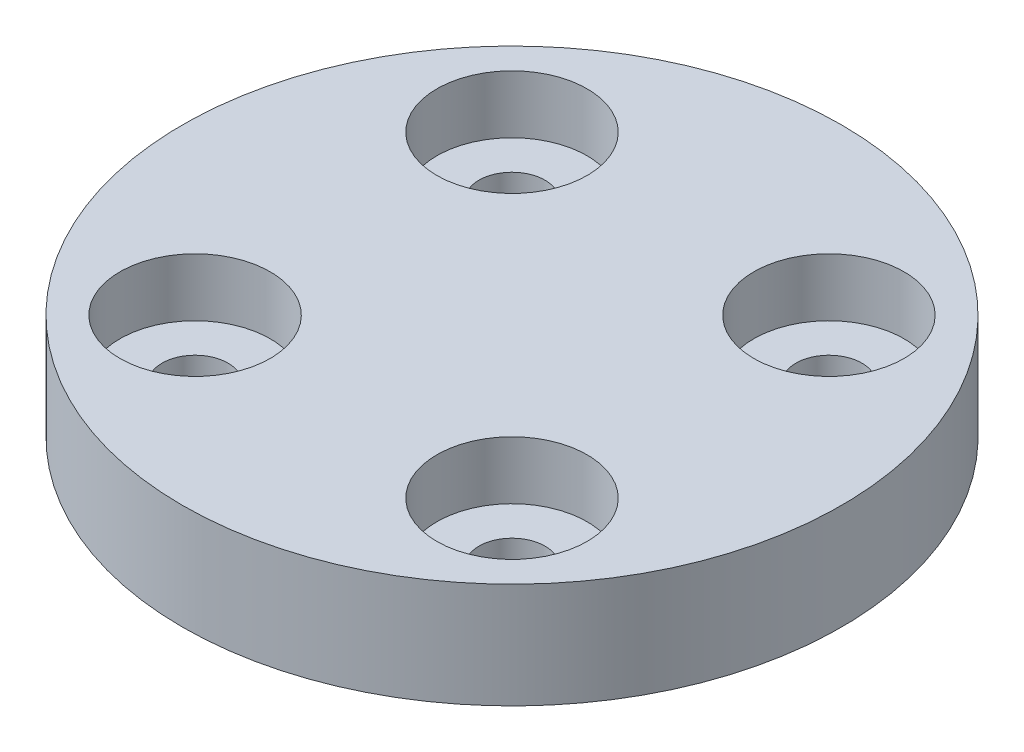
ISO-10303-21;
HEADER;
FILE_DESCRIPTION(('STEP AP214'),'2;1');
FILE_NAME('part.step','',(''),(''),'','','');
FILE_SCHEMA(('AUTOMOTIVE_DESIGN { 1 0 10303 214 1 1 1 1 }'));
ENDSEC;
DATA;
#1=APPLICATION_CONTEXT('core data for automotive mechanical design processes');
#2=APPLICATION_PROTOCOL_DEFINITION('international standard','automotive_design',2000,#1);
#3=PRODUCT_CONTEXT('',#1,'mechanical');
#4=PRODUCT('Part','Part','',(#3));
#5=PRODUCT_RELATED_PRODUCT_CATEGORY('part','',(#4));
#6=PRODUCT_DEFINITION_FORMATION('','',#4);
#7=PRODUCT_DEFINITION_CONTEXT('part definition',#1,'design');
#8=PRODUCT_DEFINITION('design','',#6,#7);
#9=PRODUCT_DEFINITION_SHAPE('','',#8);
#10=(LENGTH_UNIT() NAMED_UNIT(*) SI_UNIT(.MILLI.,.METRE.));
#11=(NAMED_UNIT(*) PLANE_ANGLE_UNIT() SI_UNIT($,.RADIAN.));
#12=(NAMED_UNIT(*) SI_UNIT($,.STERADIAN.) SOLID_ANGLE_UNIT());
#13=UNCERTAINTY_MEASURE_WITH_UNIT(LENGTH_MEASURE(1.E-05),#10,'distance_accuracy_value','');
#14=(GEOMETRIC_REPRESENTATION_CONTEXT(3) GLOBAL_UNCERTAINTY_ASSIGNED_CONTEXT((#13)) GLOBAL_UNIT_ASSIGNED_CONTEXT((#10,
#11,#12)) REPRESENTATION_CONTEXT('',''));
#15=CARTESIAN_POINT('',(0.,0.,0.));
#16=DIRECTION('',(0.,0.,1.));
#17=DIRECTION('',(1.,0.,0.));
#18=AXIS2_PLACEMENT_3D('',#15,#16,#17);
#19=CARTESIAN_POINT('',(0.,4.,0.));
#20=DIRECTION('',(0.,-1.,0.));
#21=DIRECTION('',(0.,0.,-1.));
#22=AXIS2_PLACEMENT_3D('',#19,#20,#21);
#23=CYLINDRICAL_SURFACE('',#22,12.5);
#24=CARTESIAN_POINT('',(0.,4.,0.));
#25=DIRECTION('',(0.,1.,0.));
#26=DIRECTION('',(0.,0.,1.));
#27=AXIS2_PLACEMENT_3D('',#24,#25,#26);
#28=CIRCLE('',#27,12.5);
#29=CARTESIAN_POINT('',(0.,4.,12.5));
#30=VERTEX_POINT('',#29);
#31=EDGE_CURVE('E10',#30,#30,#28,.T.);
#32=ORIENTED_EDGE('',*,*,#31,.F.);
#33=EDGE_LOOP('',(#32));
#34=FACE_BOUND('',#33,.T.);
#35=CARTESIAN_POINT('',(0.,0.,0.));
#36=DIRECTION('',(0.,1.,0.));
#37=DIRECTION('',(0.,0.,1.));
#38=AXIS2_PLACEMENT_3D('',#35,#36,#37);
#39=CIRCLE('',#38,12.5);
#40=CARTESIAN_POINT('',(0.,0.,12.5));
#41=VERTEX_POINT('',#40);
#42=EDGE_CURVE('E51',#41,#41,#39,.T.);
#43=ORIENTED_EDGE('',*,*,#42,.T.);
#44=EDGE_LOOP('',(#43));
#45=FACE_BOUND('',#44,.T.);
#46=ADVANCED_FACE('F43',(#34,#45),#23,.T.);
#47=CARTESIAN_POINT('',(0.,4.,0.));
#48=DIRECTION('',(0.,1.,0.));
#49=DIRECTION('',(0.,0.,1.));
#50=AXIS2_PLACEMENT_3D('',#47,#48,#49);
#51=PLANE('',#50);
#52=CARTESIAN_POINT('',(-6.01040764008566,4.,-6.01040764008564));
#53=DIRECTION('',(0.,1.,0.));
#54=DIRECTION('',(0.,0.,1.));
#55=AXIS2_PLACEMENT_3D('',#52,#53,#54);
#56=CIRCLE('',#55,2.85);
#57=CARTESIAN_POINT('',(-6.01040764008566,4.,-3.16040764008564));
#58=VERTEX_POINT('',#57);
#59=EDGE_CURVE('E83',#58,#58,#56,.T.);
#60=ORIENTED_EDGE('',*,*,#59,.F.);
#61=EDGE_LOOP('',(#60));
#62=FACE_BOUND('',#61,.T.);
#63=CARTESIAN_POINT('',(-6.01040764008564,4.,6.01040764008567));
#64=DIRECTION('',(0.,1.,0.));
#65=DIRECTION('',(0.,0.,1.));
#66=AXIS2_PLACEMENT_3D('',#63,#64,#65);
#67=CIRCLE('',#66,2.85);
#68=CARTESIAN_POINT('',(-6.01040764008564,4.,8.86040764008566));
#69=VERTEX_POINT('',#68);
#70=EDGE_CURVE('E109',#69,#69,#67,.T.);
#71=ORIENTED_EDGE('',*,*,#70,.F.);
#72=EDGE_LOOP('',(#71));
#73=FACE_BOUND('',#72,.T.);
#74=CARTESIAN_POINT('',(6.01040764008567,4.,6.01040764008564));
#75=DIRECTION('',(0.,1.,0.));
#76=DIRECTION('',(0.,0.,1.));
#77=AXIS2_PLACEMENT_3D('',#74,#75,#76);
#78=CIRCLE('',#77,2.85);
#79=CARTESIAN_POINT('',(6.01040764008567,4.,8.86040764008565));
#80=VERTEX_POINT('',#79);
#81=EDGE_CURVE('E98',#80,#80,#78,.T.);
#82=ORIENTED_EDGE('',*,*,#81,.F.);
#83=EDGE_LOOP('',(#82));
#84=FACE_BOUND('',#83,.T.);
#85=CARTESIAN_POINT('',(6.01040764008564,4.,-6.01040764008567));
#86=DIRECTION('',(0.,1.,0.));
#87=DIRECTION('',(0.,0.,1.));
#88=AXIS2_PLACEMENT_3D('',#85,#86,#87);
#89=CIRCLE('',#88,2.85);
#90=CARTESIAN_POINT('',(6.01040764008564,4.,-3.16040764008566));
#91=VERTEX_POINT('',#90);
#92=EDGE_CURVE('E60',#91,#91,#89,.T.);
#93=ORIENTED_EDGE('',*,*,#92,.F.);
#94=EDGE_LOOP('',(#93));
#95=FACE_BOUND('',#94,.T.);
#96=ORIENTED_EDGE('',*,*,#31,.T.);
#97=EDGE_LOOP('',(#96));
#98=FACE_BOUND('',#97,.T.);
#99=ADVANCED_FACE('F129',(#62,#73,#84,#95,#98),#51,.T.);
#100=CARTESIAN_POINT('',(0.,0.,0.));
#101=DIRECTION('',(0.,1.,0.));
#102=DIRECTION('',(0.,0.,1.));
#103=AXIS2_PLACEMENT_3D('',#100,#101,#102);
#104=PLANE('',#103);
#105=CARTESIAN_POINT('',(-6.01040764008564,0.,6.01040764008566));
#106=DIRECTION('',(0.,1.,0.));
#107=DIRECTION('',(0.,0.,1.));
#108=AXIS2_PLACEMENT_3D('',#105,#106,#107);
#109=CIRCLE('',#108,1.25);
#110=CARTESIAN_POINT('',(-6.01040764008564,0.,7.26040764008566));
#111=VERTEX_POINT('',#110);
#112=EDGE_CURVE('E46',#111,#111,#109,.T.);
#113=ORIENTED_EDGE('',*,*,#112,.T.);
#114=EDGE_LOOP('',(#113));
#115=FACE_BOUND('',#114,.T.);
#116=CARTESIAN_POINT('',(6.01040764008567,0.,6.01040764008564));
#117=DIRECTION('',(0.,1.,0.));
#118=DIRECTION('',(0.,0.,1.));
#119=AXIS2_PLACEMENT_3D('',#116,#117,#118);
#120=CIRCLE('',#119,1.25);
#121=CARTESIAN_POINT('',(6.01040764008567,0.,7.26040764008564));
#122=VERTEX_POINT('',#121);
#123=EDGE_CURVE('E71',#122,#122,#120,.T.);
#124=ORIENTED_EDGE('',*,*,#123,.T.);
#125=EDGE_LOOP('',(#124));
#126=FACE_BOUND('',#125,.T.);
#127=CARTESIAN_POINT('',(6.01040764008564,0.,-6.01040764008566));
#128=DIRECTION('',(0.,1.,0.));
#129=DIRECTION('',(0.,0.,1.));
#130=AXIS2_PLACEMENT_3D('',#127,#128,#129);
#131=CIRCLE('',#130,1.25);
#132=CARTESIAN_POINT('',(6.01040764008564,0.,-4.76040764008566));
#133=VERTEX_POINT('',#132);
#134=EDGE_CURVE('E67',#133,#133,#131,.T.);
#135=ORIENTED_EDGE('',*,*,#134,.T.);
#136=EDGE_LOOP('',(#135));
#137=FACE_BOUND('',#136,.T.);
#138=CARTESIAN_POINT('',(-6.01040764008566,0.,-6.01040764008564));
#139=DIRECTION('',(0.,1.,0.));
#140=DIRECTION('',(0.,0.,1.));
#141=AXIS2_PLACEMENT_3D('',#138,#139,#140);
#142=CIRCLE('',#141,1.25);
#143=CARTESIAN_POINT('',(-6.01040764008566,0.,-4.76040764008564));
#144=VERTEX_POINT('',#143);
#145=EDGE_CURVE('E63',#144,#144,#142,.T.);
#146=ORIENTED_EDGE('',*,*,#145,.T.);
#147=EDGE_LOOP('',(#146));
#148=FACE_BOUND('',#147,.T.);
#149=ORIENTED_EDGE('',*,*,#42,.F.);
#150=EDGE_LOOP('',(#149));
#151=FACE_BOUND('',#150,.T.);
#152=ADVANCED_FACE('F132',(#115,#126,#137,#148,#151),#104,.F.);
#153=CARTESIAN_POINT('',(6.01040764008564,1.8,-6.01040764008567));
#154=DIRECTION('',(0.,1.,0.));
#155=DIRECTION('',(0.,0.,1.));
#156=AXIS2_PLACEMENT_3D('',#153,#154,#155);
#157=CYLINDRICAL_SURFACE('',#156,2.85);
#158=CARTESIAN_POINT('',(6.01040764008564,1.8,-6.01040764008567));
#159=DIRECTION('',(0.,1.,0.));
#160=DIRECTION('',(0.,0.,1.));
#161=AXIS2_PLACEMENT_3D('',#158,#159,#160);
#162=CIRCLE('',#161,2.85);
#163=CARTESIAN_POINT('',(6.01040764008564,1.8,-3.16040764008566));
#164=VERTEX_POINT('',#163);
#165=EDGE_CURVE('E57',#164,#164,#162,.T.);
#166=ORIENTED_EDGE('',*,*,#165,.F.);
#167=EDGE_LOOP('',(#166));
#168=FACE_BOUND('',#167,.T.);
#169=ORIENTED_EDGE('',*,*,#92,.T.);
#170=EDGE_LOOP('',(#169));
#171=FACE_BOUND('',#170,.T.);
#172=ADVANCED_FACE('F141',(#168,#171),#157,.F.);
#173=CARTESIAN_POINT('',(6.01040764008564,1.8,-6.01040764008567));
#174=DIRECTION('',(0.,1.,0.));
#175=DIRECTION('',(0.,0.,1.));
#176=AXIS2_PLACEMENT_3D('',#173,#174,#175);
#177=PLANE('',#176);
#178=CARTESIAN_POINT('',(6.01040764008564,1.8,-6.01040764008566));
#179=DIRECTION('',(0.,1.,0.));
#180=DIRECTION('',(0.,0.,1.));
#181=AXIS2_PLACEMENT_3D('',#178,#179,#180);
#182=CIRCLE('',#181,1.25);
#183=CARTESIAN_POINT('',(6.01040764008564,1.8,-4.76040764008566));
#184=VERTEX_POINT('',#183);
#185=EDGE_CURVE('E189',#184,#184,#182,.T.);
#186=ORIENTED_EDGE('',*,*,#185,.F.);
#187=EDGE_LOOP('',(#186));
#188=FACE_BOUND('',#187,.T.);
#189=ORIENTED_EDGE('',*,*,#165,.T.);
#190=EDGE_LOOP('',(#189));
#191=FACE_BOUND('',#190,.T.);
#192=ADVANCED_FACE('F146',(#188,#191),#177,.T.);
#193=CARTESIAN_POINT('',(6.01040764008567,1.8,6.01040764008564));
#194=DIRECTION('',(0.,1.,0.));
#195=DIRECTION('',(0.,0.,1.));
#196=AXIS2_PLACEMENT_3D('',#193,#194,#195);
#197=CYLINDRICAL_SURFACE('',#196,2.85);
#198=CARTESIAN_POINT('',(6.01040764008567,1.8,6.01040764008564));
#199=DIRECTION('',(0.,1.,0.));
#200=DIRECTION('',(0.,0.,1.));
#201=AXIS2_PLACEMENT_3D('',#198,#199,#200);
#202=CIRCLE('',#201,2.85);
#203=CARTESIAN_POINT('',(6.01040764008567,1.8,8.86040764008565));
#204=VERTEX_POINT('',#203);
#205=EDGE_CURVE('E103',#204,#204,#202,.T.);
#206=ORIENTED_EDGE('',*,*,#205,.F.);
#207=EDGE_LOOP('',(#206));
#208=FACE_BOUND('',#207,.T.);
#209=ORIENTED_EDGE('',*,*,#81,.T.);
#210=EDGE_LOOP('',(#209));
#211=FACE_BOUND('',#210,.T.);
#212=ADVANCED_FACE('F150',(#208,#211),#197,.F.);
#213=CARTESIAN_POINT('',(6.01040764008567,1.8,6.01040764008564));
#214=DIRECTION('',(0.,1.,0.));
#215=DIRECTION('',(0.,0.,1.));
#216=AXIS2_PLACEMENT_3D('',#213,#214,#215);
#217=PLANE('',#216);
#218=CARTESIAN_POINT('',(6.01040764008567,1.8,6.01040764008564));
#219=DIRECTION('',(0.,1.,0.));
#220=DIRECTION('',(0.,0.,1.));
#221=AXIS2_PLACEMENT_3D('',#218,#219,#220);
#222=CIRCLE('',#221,1.25);
#223=CARTESIAN_POINT('',(6.01040764008567,1.8,7.26040764008564));
#224=VERTEX_POINT('',#223);
#225=EDGE_CURVE('E199',#224,#224,#222,.T.);
#226=ORIENTED_EDGE('',*,*,#225,.F.);
#227=EDGE_LOOP('',(#226));
#228=FACE_BOUND('',#227,.T.);
#229=ORIENTED_EDGE('',*,*,#205,.T.);
#230=EDGE_LOOP('',(#229));
#231=FACE_BOUND('',#230,.T.);
#232=ADVANCED_FACE('F125',(#228,#231),#217,.T.);
#233=CARTESIAN_POINT('',(-6.01040764008564,1.8,6.01040764008567));
#234=DIRECTION('',(0.,1.,0.));
#235=DIRECTION('',(0.,0.,1.));
#236=AXIS2_PLACEMENT_3D('',#233,#234,#235);
#237=CYLINDRICAL_SURFACE('',#236,2.85);
#238=CARTESIAN_POINT('',(-6.01040764008564,1.8,6.01040764008567));
#239=DIRECTION('',(0.,1.,0.));
#240=DIRECTION('',(0.,0.,1.));
#241=AXIS2_PLACEMENT_3D('',#238,#239,#240);
#242=CIRCLE('',#241,2.85);
#243=CARTESIAN_POINT('',(-6.01040764008564,1.8,8.86040764008566));
#244=VERTEX_POINT('',#243);
#245=EDGE_CURVE('E89',#244,#244,#242,.T.);
#246=ORIENTED_EDGE('',*,*,#245,.F.);
#247=EDGE_LOOP('',(#246));
#248=FACE_BOUND('',#247,.T.);
#249=ORIENTED_EDGE('',*,*,#70,.T.);
#250=EDGE_LOOP('',(#249));
#251=FACE_BOUND('',#250,.T.);
#252=ADVANCED_FACE('F122',(#248,#251),#237,.F.);
#253=CARTESIAN_POINT('',(-6.01040764008564,1.8,6.01040764008567));
#254=DIRECTION('',(0.,1.,0.));
#255=DIRECTION('',(0.,0.,1.));
#256=AXIS2_PLACEMENT_3D('',#253,#254,#255);
#257=PLANE('',#256);
#258=CARTESIAN_POINT('',(-6.01040764008564,1.8,6.01040764008566));
#259=DIRECTION('',(0.,1.,0.));
#260=DIRECTION('',(0.,0.,1.));
#261=AXIS2_PLACEMENT_3D('',#258,#259,#260);
#262=CIRCLE('',#261,1.25);
#263=CARTESIAN_POINT('',(-6.01040764008564,1.8,7.26040764008566));
#264=VERTEX_POINT('',#263);
#265=EDGE_CURVE('E205',#264,#264,#262,.T.);
#266=ORIENTED_EDGE('',*,*,#265,.F.);
#267=EDGE_LOOP('',(#266));
#268=FACE_BOUND('',#267,.T.);
#269=ORIENTED_EDGE('',*,*,#245,.T.);
#270=EDGE_LOOP('',(#269));
#271=FACE_BOUND('',#270,.T.);
#272=ADVANCED_FACE('F120',(#268,#271),#257,.T.);
#273=CARTESIAN_POINT('',(-6.01040764008566,1.8,-6.01040764008564));
#274=DIRECTION('',(0.,1.,0.));
#275=DIRECTION('',(0.,0.,1.));
#276=AXIS2_PLACEMENT_3D('',#273,#274,#275);
#277=CYLINDRICAL_SURFACE('',#276,2.85);
#278=CARTESIAN_POINT('',(-6.01040764008566,1.8,-6.01040764008564));
#279=DIRECTION('',(0.,1.,0.));
#280=DIRECTION('',(0.,0.,1.));
#281=AXIS2_PLACEMENT_3D('',#278,#279,#280);
#282=CIRCLE('',#281,2.85);
#283=CARTESIAN_POINT('',(-6.01040764008566,1.8,-3.16040764008564));
#284=VERTEX_POINT('',#283);
#285=EDGE_CURVE('E78',#284,#284,#282,.T.);
#286=ORIENTED_EDGE('',*,*,#285,.F.);
#287=EDGE_LOOP('',(#286));
#288=FACE_BOUND('',#287,.T.);
#289=ORIENTED_EDGE('',*,*,#59,.T.);
#290=EDGE_LOOP('',(#289));
#291=FACE_BOUND('',#290,.T.);
#292=ADVANCED_FACE('F156',(#288,#291),#277,.F.);
#293=CARTESIAN_POINT('',(-6.01040764008566,1.8,-6.01040764008564));
#294=DIRECTION('',(0.,1.,0.));
#295=DIRECTION('',(0.,0.,1.));
#296=AXIS2_PLACEMENT_3D('',#293,#294,#295);
#297=PLANE('',#296);
#298=CARTESIAN_POINT('',(-6.01040764008566,1.8,-6.01040764008564));
#299=DIRECTION('',(0.,1.,0.));
#300=DIRECTION('',(0.,0.,1.));
#301=AXIS2_PLACEMENT_3D('',#298,#299,#300);
#302=CIRCLE('',#301,1.25);
#303=CARTESIAN_POINT('',(-6.01040764008566,1.8,-4.76040764008564));
#304=VERTEX_POINT('',#303);
#305=EDGE_CURVE('E68',#304,#304,#302,.T.);
#306=ORIENTED_EDGE('',*,*,#305,.F.);
#307=EDGE_LOOP('',(#306));
#308=FACE_BOUND('',#307,.T.);
#309=ORIENTED_EDGE('',*,*,#285,.T.);
#310=EDGE_LOOP('',(#309));
#311=FACE_BOUND('',#310,.T.);
#312=ADVANCED_FACE('F152',(#308,#311),#297,.T.);
#313=CARTESIAN_POINT('',(-6.01040764008566,-8.2,-6.01040764008564));
#314=DIRECTION('',(0.,1.,0.));
#315=DIRECTION('',(0.,0.,1.));
#316=AXIS2_PLACEMENT_3D('',#313,#314,#315);
#317=CYLINDRICAL_SURFACE('',#316,1.25);
#318=ORIENTED_EDGE('',*,*,#305,.T.);
#319=EDGE_LOOP('',(#318));
#320=FACE_BOUND('',#319,.T.);
#321=ORIENTED_EDGE('',*,*,#145,.F.);
#322=EDGE_LOOP('',(#321));
#323=FACE_BOUND('',#322,.T.);
#324=ADVANCED_FACE('F155',(#320,#323),#317,.F.);
#325=CARTESIAN_POINT('',(6.01040764008564,-8.2,-6.01040764008566));
#326=DIRECTION('',(0.,1.,0.));
#327=DIRECTION('',(0.,0.,1.));
#328=AXIS2_PLACEMENT_3D('',#325,#326,#327);
#329=CYLINDRICAL_SURFACE('',#328,1.25);
#330=ORIENTED_EDGE('',*,*,#185,.T.);
#331=EDGE_LOOP('',(#330));
#332=FACE_BOUND('',#331,.T.);
#333=ORIENTED_EDGE('',*,*,#134,.F.);
#334=EDGE_LOOP('',(#333));
#335=FACE_BOUND('',#334,.T.);
#336=ADVANCED_FACE('F172',(#332,#335),#329,.F.);
#337=CARTESIAN_POINT('',(6.01040764008567,-8.2,6.01040764008564));
#338=DIRECTION('',(0.,1.,0.));
#339=DIRECTION('',(0.,0.,1.));
#340=AXIS2_PLACEMENT_3D('',#337,#338,#339);
#341=CYLINDRICAL_SURFACE('',#340,1.25);
#342=ORIENTED_EDGE('',*,*,#225,.T.);
#343=EDGE_LOOP('',(#342));
#344=FACE_BOUND('',#343,.T.);
#345=ORIENTED_EDGE('',*,*,#123,.F.);
#346=EDGE_LOOP('',(#345));
#347=FACE_BOUND('',#346,.T.);
#348=ADVANCED_FACE('F177',(#344,#347),#341,.F.);
#349=CARTESIAN_POINT('',(-6.01040764008564,-8.2,6.01040764008566));
#350=DIRECTION('',(0.,1.,0.));
#351=DIRECTION('',(0.,0.,1.));
#352=AXIS2_PLACEMENT_3D('',#349,#350,#351);
#353=CYLINDRICAL_SURFACE('',#352,1.25);
#354=ORIENTED_EDGE('',*,*,#265,.T.);
#355=EDGE_LOOP('',(#354));
#356=FACE_BOUND('',#355,.T.);
#357=ORIENTED_EDGE('',*,*,#112,.F.);
#358=EDGE_LOOP('',(#357));
#359=FACE_BOUND('',#358,.T.);
#360=ADVANCED_FACE('F174',(#356,#359),#353,.F.);
#361=CLOSED_SHELL('',(#46,#99,#152,#172,#192,#212,#232,#252,#272,#292,#312,#324,#336,#348,#360));
#362=MANIFOLD_SOLID_BREP('B2',#361);
#363=ADVANCED_BREP_SHAPE_REPRESENTATION('',(#18,#362),#14);
#364=SHAPE_DEFINITION_REPRESENTATION(#9,#363);
ENDSEC;
END-ISO-10303-21;
